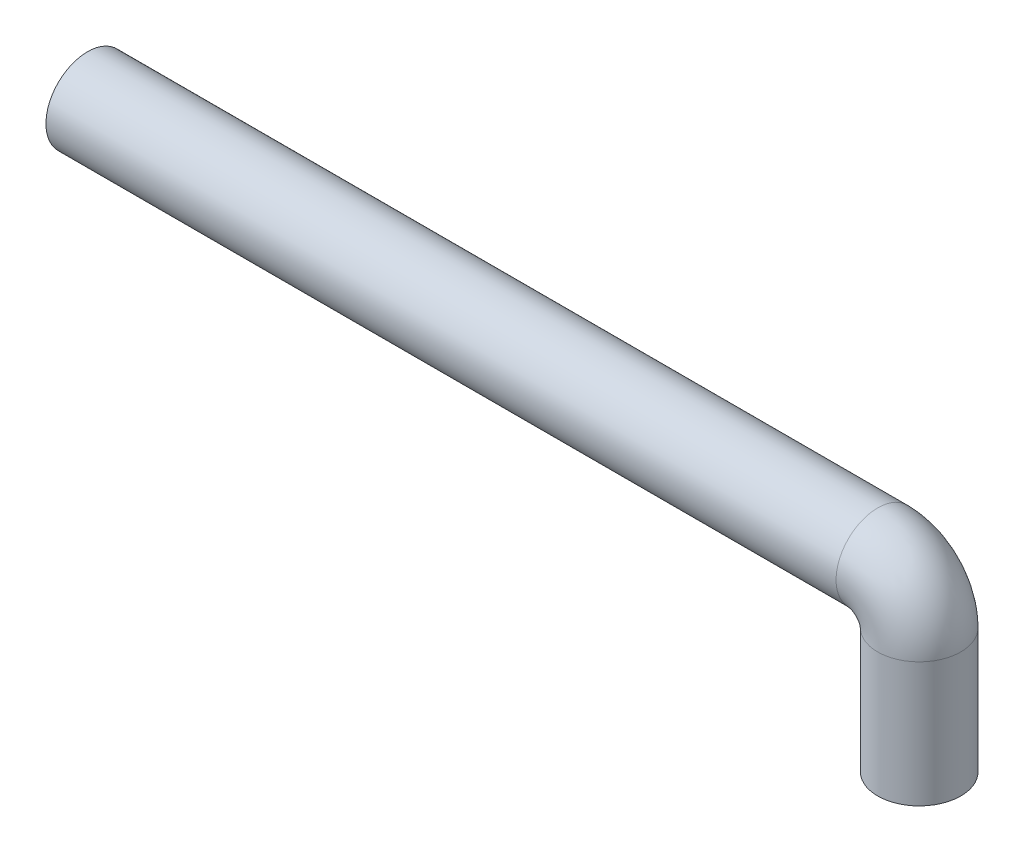
ISO-10303-21;
HEADER;
FILE_DESCRIPTION(('STEP AP214'),'2;1');
FILE_NAME('part.step','',(''),(''),'','','');
FILE_SCHEMA(('AUTOMOTIVE_DESIGN { 1 0 10303 214 1 1 1 1 }'));
ENDSEC;
DATA;
#1=APPLICATION_CONTEXT('core data for automotive mechanical design processes');
#2=APPLICATION_PROTOCOL_DEFINITION('international standard','automotive_design',2000,#1);
#3=PRODUCT_CONTEXT('',#1,'mechanical');
#4=PRODUCT('Part','Part','',(#3));
#5=PRODUCT_RELATED_PRODUCT_CATEGORY('part','',(#4));
#6=PRODUCT_DEFINITION_FORMATION('','',#4);
#7=PRODUCT_DEFINITION_CONTEXT('part definition',#1,'design');
#8=PRODUCT_DEFINITION('design','',#6,#7);
#9=PRODUCT_DEFINITION_SHAPE('','',#8);
#10=(LENGTH_UNIT() NAMED_UNIT(*) SI_UNIT(.MILLI.,.METRE.));
#11=(NAMED_UNIT(*) PLANE_ANGLE_UNIT() SI_UNIT($,.RADIAN.));
#12=(NAMED_UNIT(*) SI_UNIT($,.STERADIAN.) SOLID_ANGLE_UNIT());
#13=UNCERTAINTY_MEASURE_WITH_UNIT(LENGTH_MEASURE(1.E-05),#10,'distance_accuracy_value','');
#14=(GEOMETRIC_REPRESENTATION_CONTEXT(3) GLOBAL_UNCERTAINTY_ASSIGNED_CONTEXT((#13)) GLOBAL_UNIT_ASSIGNED_CONTEXT((#10,
#11,#12)) REPRESENTATION_CONTEXT('',''));
#15=CARTESIAN_POINT('',(0.,0.,0.));
#16=DIRECTION('',(0.,0.,1.));
#17=DIRECTION('',(1.,0.,0.));
#18=AXIS2_PLACEMENT_3D('',#15,#16,#17);
#19=CARTESIAN_POINT('',(0.,0.,0.));
#20=DIRECTION('',(1.,0.,0.));
#21=DIRECTION('',(0.,0.,-1.));
#22=AXIS2_PLACEMENT_3D('',#19,#20,#21);
#23=PLANE('',#22);
#24=CARTESIAN_POINT('',(0.,0.,0.));
#25=DIRECTION('',(1.,0.,0.));
#26=DIRECTION('',(0.,0.,-1.));
#27=AXIS2_PLACEMENT_3D('',#24,#25,#26);
#28=CIRCLE('',#27,1.5875);
#29=CARTESIAN_POINT('',(0.,0.,-1.5875));
#30=VERTEX_POINT('',#29);
#31=EDGE_CURVE('E49',#30,#30,#28,.T.);
#32=ORIENTED_EDGE('',*,*,#31,.F.);
#33=EDGE_LOOP('',(#32));
#34=FACE_BOUND('',#33,.T.);
#35=ADVANCED_FACE('F33',(#34),#23,.F.);
#36=CARTESIAN_POINT('',(31.75,-6.35,0.));
#37=DIRECTION('',(0.,-1.,0.));
#38=DIRECTION('',(0.,0.,-1.));
#39=AXIS2_PLACEMENT_3D('',#36,#37,#38);
#40=PLANE('',#39);
#41=CARTESIAN_POINT('',(31.75,-6.35,0.));
#42=DIRECTION('',(0.,-1.,0.));
#43=DIRECTION('',(0.,0.,-1.));
#44=AXIS2_PLACEMENT_3D('',#41,#42,#43);
#45=CIRCLE('',#44,1.5875);
#46=CARTESIAN_POINT('',(31.75,-6.35,-1.5875));
#47=VERTEX_POINT('',#46);
#48=EDGE_CURVE('E11',#47,#47,#45,.T.);
#49=ORIENTED_EDGE('',*,*,#48,.T.);
#50=EDGE_LOOP('',(#49));
#51=FACE_BOUND('',#50,.T.);
#52=ADVANCED_FACE('F56',(#51),#40,.T.);
#53=CARTESIAN_POINT('',(0.,0.,0.));
#54=DIRECTION('',(1.,0.,0.));
#55=DIRECTION('',(0.,0.,-1.));
#56=AXIS2_PLACEMENT_3D('',#53,#54,#55);
#57=CYLINDRICAL_SURFACE('',#56,1.5875);
#58=CARTESIAN_POINT('',(30.1625,0.,0.));
#59=DIRECTION('',(1.,0.,0.));
#60=DIRECTION('',(0.,0.,-1.));
#61=AXIS2_PLACEMENT_3D('',#58,#59,#60);
#62=CIRCLE('',#61,1.5875);
#63=CARTESIAN_POINT('',(30.1625,-1.5875,0.));
#64=VERTEX_POINT('',#63);
#65=EDGE_CURVE('E43',#64,#64,#62,.T.);
#66=ORIENTED_EDGE('',*,*,#65,.F.);
#67=EDGE_LOOP('',(#66));
#68=FACE_BOUND('',#67,.T.);
#69=ORIENTED_EDGE('',*,*,#31,.T.);
#70=EDGE_LOOP('',(#69));
#71=FACE_BOUND('',#70,.T.);
#72=ADVANCED_FACE('F44',(#68,#71),#57,.T.);
#73=CARTESIAN_POINT('',(28.575,-1.5875,0.));
#74=DIRECTION('',(0.,-1.,0.));
#75=DIRECTION('',(-1.,0.,0.));
#76=AXIS2_PLACEMENT_3D('',#73,#74,#75);
#77=CIRCLE('',#76,1.5875);
#78=TRIMMED_CURVE('',#77,(PARAMETER_VALUE(-3.14159257908399)),
(PARAMETER_VALUE(3.14159257908399)),.T.,.PARAMETER.);
#79=CARTESIAN_POINT('',(30.1625,-1.5875,0.));
#80=DIRECTION('',(0.,0.,-1.));
#81=AXIS1_PLACEMENT('',#79,#80);
#82=SURFACE_OF_REVOLUTION('',#78,#81);
#83=CARTESIAN_POINT('',(31.75,-1.5875,0.));
#84=DIRECTION('',(0.,-1.,0.));
#85=DIRECTION('',(0.,0.,-1.));
#86=AXIS2_PLACEMENT_3D('',#83,#84,#85);
#87=CIRCLE('',#86,1.5875);
#88=EDGE_CURVE('E39',#64,#64,#87,.T.);
#89=ORIENTED_EDGE('',*,*,#88,.F.);
#90=ORIENTED_EDGE('',*,*,#65,.T.);
#91=EDGE_LOOP('',(#89,#90));
#92=FACE_BOUND('',#91,.T.);
#93=ADVANCED_FACE('F63',(#92),#82,.T.);
#94=CARTESIAN_POINT('',(31.75,-1.5875,0.));
#95=DIRECTION('',(0.,-1.,0.));
#96=DIRECTION('',(0.,0.,-1.));
#97=AXIS2_PLACEMENT_3D('',#94,#95,#96);
#98=CYLINDRICAL_SURFACE('',#97,1.5875);
#99=ORIENTED_EDGE('',*,*,#48,.F.);
#100=EDGE_LOOP('',(#99));
#101=FACE_BOUND('',#100,.T.);
#102=ORIENTED_EDGE('',*,*,#88,.T.);
#103=EDGE_LOOP('',(#102));
#104=FACE_BOUND('',#103,.T.);
#105=ADVANCED_FACE('F61',(#101,#104),#98,.T.);
#106=CLOSED_SHELL('',(#35,#52,#72,#93,#105));
#107=MANIFOLD_SOLID_BREP('B2',#106);
#108=ADVANCED_BREP_SHAPE_REPRESENTATION('',(#18,#107),#14);
#109=SHAPE_DEFINITION_REPRESENTATION(#9,#108);
ENDSEC;
END-ISO-10303-21;
